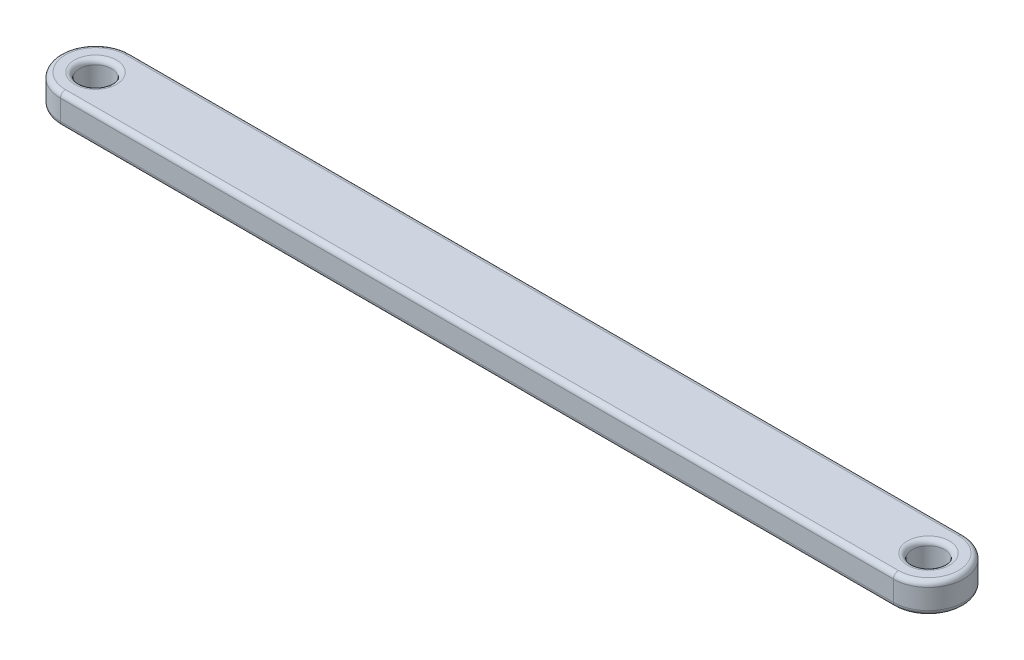
ISO-10303-21;
HEADER;
FILE_DESCRIPTION(('STEP AP214'),'2;1');
FILE_NAME('part.step','',(''),(''),'','','');
FILE_SCHEMA(('AUTOMOTIVE_DESIGN { 1 0 10303 214 1 1 1 1 }'));
ENDSEC;
DATA;
#1=APPLICATION_CONTEXT('core data for automotive mechanical design processes');
#2=APPLICATION_PROTOCOL_DEFINITION('international standard','automotive_design',2000,#1);
#3=PRODUCT_CONTEXT('',#1,'mechanical');
#4=PRODUCT('Part','Part','',(#3));
#5=PRODUCT_RELATED_PRODUCT_CATEGORY('part','',(#4));
#6=PRODUCT_DEFINITION_FORMATION('','',#4);
#7=PRODUCT_DEFINITION_CONTEXT('part definition',#1,'design');
#8=PRODUCT_DEFINITION('design','',#6,#7);
#9=PRODUCT_DEFINITION_SHAPE('','',#8);
#10=(LENGTH_UNIT() NAMED_UNIT(*) SI_UNIT(.MILLI.,.METRE.));
#11=(NAMED_UNIT(*) PLANE_ANGLE_UNIT() SI_UNIT($,.RADIAN.));
#12=(NAMED_UNIT(*) SI_UNIT($,.STERADIAN.) SOLID_ANGLE_UNIT());
#13=UNCERTAINTY_MEASURE_WITH_UNIT(LENGTH_MEASURE(1.E-05),#10,'distance_accuracy_value','');
#14=(GEOMETRIC_REPRESENTATION_CONTEXT(3) GLOBAL_UNCERTAINTY_ASSIGNED_CONTEXT((#13)) GLOBAL_UNIT_ASSIGNED_CONTEXT((#10,
#11,#12)) REPRESENTATION_CONTEXT('',''));
#15=CARTESIAN_POINT('',(0.,0.,0.));
#16=DIRECTION('',(0.,0.,1.));
#17=DIRECTION('',(1.,0.,0.));
#18=AXIS2_PLACEMENT_3D('',#15,#16,#17);
#19=CARTESIAN_POINT('',(-41.55,3.,0.));
#20=DIRECTION('',(0.,1.,0.));
#21=DIRECTION('',(0.,0.,1.));
#22=AXIS2_PLACEMENT_3D('',#19,#20,#21);
#23=PLANE('',#22);
#24=CARTESIAN_POINT('',(-41.55,3.,0.));
#25=DIRECTION('',(0.,1.,0.));
#26=DIRECTION('',(0.,0.,1.));
#27=AXIS2_PLACEMENT_3D('',#24,#25,#26);
#28=CIRCLE('',#27,2.1);
#29=CARTESIAN_POINT('',(-41.55,3.,2.1));
#30=VERTEX_POINT('',#29);
#31=EDGE_CURVE('E11',#30,#30,#28,.F.);
#32=ORIENTED_EDGE('',*,*,#31,.T.);
#33=EDGE_LOOP('',(#32));
#34=FACE_BOUND('',#33,.T.);
#35=CARTESIAN_POINT('',(41.55,3.,0.));
#36=DIRECTION('',(0.,1.,0.));
#37=DIRECTION('',(0.,0.,1.));
#38=AXIS2_PLACEMENT_3D('',#35,#36,#37);
#39=CIRCLE('',#38,3.);
#40=CARTESIAN_POINT('',(41.55,3.,2.99999999999998));
#41=VERTEX_POINT('',#40);
#42=CARTESIAN_POINT('',(41.55,3.,-3.00000000000001));
#43=VERTEX_POINT('',#42);
#44=EDGE_CURVE('E54',#41,#43,#39,.T.);
#45=ORIENTED_EDGE('',*,*,#44,.T.);
#46=DIRECTION('',(-1.,0.,0.));
#47=VECTOR('',#46,1.);
#48=CARTESIAN_POINT('',(-41.55,3.,-3.));
#49=LINE('',#48,#47);
#50=CARTESIAN_POINT('',(-41.55,3.,-3.));
#51=VERTEX_POINT('',#50);
#52=EDGE_CURVE('E46',#43,#51,#49,.T.);
#53=ORIENTED_EDGE('',*,*,#52,.T.);
#54=CARTESIAN_POINT('',(-41.55,3.,0.));
#55=DIRECTION('',(0.,1.,0.));
#56=DIRECTION('',(0.,0.,1.));
#57=AXIS2_PLACEMENT_3D('',#54,#55,#56);
#58=CIRCLE('',#57,3.);
#59=CARTESIAN_POINT('',(-41.55,3.,3.));
#60=VERTEX_POINT('',#59);
#61=EDGE_CURVE('E172',#51,#60,#58,.T.);
#62=ORIENTED_EDGE('',*,*,#61,.T.);
#63=DIRECTION('',(1.,0.,0.));
#64=VECTOR('',#63,1.);
#65=CARTESIAN_POINT('',(41.55,3.,2.99999999999998));
#66=LINE('',#65,#64);
#67=EDGE_CURVE('E59',#60,#41,#66,.T.);
#68=ORIENTED_EDGE('',*,*,#67,.T.);
#69=EDGE_LOOP('',(#45,#53,#62,#68));
#70=FACE_BOUND('',#69,.T.);
#71=CARTESIAN_POINT('',(41.55,3.,0.));
#72=DIRECTION('',(0.,1.,0.));
#73=DIRECTION('',(0.,0.,1.));
#74=AXIS2_PLACEMENT_3D('',#71,#72,#73);
#75=CIRCLE('',#74,2.1);
#76=CARTESIAN_POINT('',(41.55,3.,2.09999999999998));
#77=VERTEX_POINT('',#76);
#78=EDGE_CURVE('E169',#77,#77,#75,.F.);
#79=ORIENTED_EDGE('',*,*,#78,.T.);
#80=EDGE_LOOP('',(#79));
#81=FACE_BOUND('',#80,.T.);
#82=ADVANCED_FACE('F37',(#34,#70,#81),#23,.T.);
#83=CARTESIAN_POINT('',(-41.55,0.,0.));
#84=DIRECTION('',(0.,1.,0.));
#85=DIRECTION('',(0.,0.,1.));
#86=AXIS2_PLACEMENT_3D('',#83,#84,#85);
#87=PLANE('',#86);
#88=CARTESIAN_POINT('',(-41.55,0.,0.));
#89=DIRECTION('',(0.,1.,0.));
#90=DIRECTION('',(0.,0.,1.));
#91=AXIS2_PLACEMENT_3D('',#88,#89,#90);
#92=CIRCLE('',#91,2.1);
#93=CARTESIAN_POINT('',(-41.55,0.,2.1));
#94=VERTEX_POINT('',#93);
#95=EDGE_CURVE('E134',#94,#94,#92,.T.);
#96=ORIENTED_EDGE('',*,*,#95,.T.);
#97=EDGE_LOOP('',(#96));
#98=FACE_BOUND('',#97,.T.);
#99=CARTESIAN_POINT('',(41.55,0.,0.));
#100=DIRECTION('',(0.,1.,0.));
#101=DIRECTION('',(0.,0.,1.));
#102=AXIS2_PLACEMENT_3D('',#99,#100,#101);
#103=CIRCLE('',#102,2.1);
#104=CARTESIAN_POINT('',(41.55,0.,2.09999999999998));
#105=VERTEX_POINT('',#104);
#106=EDGE_CURVE('E131',#105,#105,#103,.T.);
#107=ORIENTED_EDGE('',*,*,#106,.T.);
#108=EDGE_LOOP('',(#107));
#109=FACE_BOUND('',#108,.T.);
#110=CARTESIAN_POINT('',(41.55,0.,0.));
#111=DIRECTION('',(0.,1.,0.));
#112=DIRECTION('',(0.,0.,1.));
#113=AXIS2_PLACEMENT_3D('',#110,#111,#112);
#114=CIRCLE('',#113,3.);
#115=CARTESIAN_POINT('',(41.55,0.,-3.00000000000001));
#116=VERTEX_POINT('',#115);
#117=CARTESIAN_POINT('',(41.55,0.,2.99999999999998));
#118=VERTEX_POINT('',#117);
#119=EDGE_CURVE('E130',#116,#118,#114,.F.);
#120=ORIENTED_EDGE('',*,*,#119,.T.);
#121=DIRECTION('',(1.,0.,0.));
#122=VECTOR('',#121,1.);
#123=CARTESIAN_POINT('',(-41.55,0.,3.));
#124=LINE('',#123,#122);
#125=CARTESIAN_POINT('',(-41.55,0.,3.));
#126=VERTEX_POINT('',#125);
#127=EDGE_CURVE('E109',#118,#126,#124,.F.);
#128=ORIENTED_EDGE('',*,*,#127,.T.);
#129=CARTESIAN_POINT('',(-41.55,0.,0.));
#130=DIRECTION('',(0.,1.,0.));
#131=DIRECTION('',(0.,0.,1.));
#132=AXIS2_PLACEMENT_3D('',#129,#130,#131);
#133=CIRCLE('',#132,3.);
#134=CARTESIAN_POINT('',(-41.55,0.,-3.));
#135=VERTEX_POINT('',#134);
#136=EDGE_CURVE('E119',#126,#135,#133,.F.);
#137=ORIENTED_EDGE('',*,*,#136,.T.);
#138=DIRECTION('',(-1.,0.,0.));
#139=VECTOR('',#138,1.);
#140=CARTESIAN_POINT('',(-41.55,0.,-3.));
#141=LINE('',#140,#139);
#142=EDGE_CURVE('E125',#135,#116,#141,.F.);
#143=ORIENTED_EDGE('',*,*,#142,.T.);
#144=EDGE_LOOP('',(#120,#128,#137,#143));
#145=FACE_BOUND('',#144,.T.);
#146=ADVANCED_FACE('F128',(#98,#109,#145),#87,.F.);
#147=CARTESIAN_POINT('',(-41.55,3.,0.));
#148=DIRECTION('',(0.,-1.,0.));
#149=DIRECTION('',(0.,0.,-1.));
#150=AXIS2_PLACEMENT_3D('',#147,#148,#149);
#151=CYLINDRICAL_SURFACE('',#150,3.5);
#152=DIRECTION('',(0.,-1.,0.));
#153=VECTOR('',#152,1.);
#154=CARTESIAN_POINT('',(-41.55,3.,-3.5));
#155=LINE('',#154,#153);
#156=CARTESIAN_POINT('',(-41.55,2.5,-3.5));
#157=VERTEX_POINT('',#156);
#158=CARTESIAN_POINT('',(-41.55,0.5,-3.5));
#159=VERTEX_POINT('',#158);
#160=EDGE_CURVE('E181',#157,#159,#155,.T.);
#161=ORIENTED_EDGE('',*,*,#160,.T.);
#162=CARTESIAN_POINT('',(-41.55,0.5,0.));
#163=DIRECTION('',(0.,1.,0.));
#164=DIRECTION('',(0.,0.,1.));
#165=AXIS2_PLACEMENT_3D('',#162,#163,#164);
#166=CIRCLE('',#165,3.5);
#167=CARTESIAN_POINT('',(-41.55,0.5,3.5));
#168=VERTEX_POINT('',#167);
#169=EDGE_CURVE('E167',#159,#168,#166,.T.);
#170=ORIENTED_EDGE('',*,*,#169,.T.);
#171=DIRECTION('',(0.,-1.,0.));
#172=VECTOR('',#171,1.);
#173=CARTESIAN_POINT('',(-41.55,3.,3.5));
#174=LINE('',#173,#172);
#175=CARTESIAN_POINT('',(-41.55,2.5,3.5));
#176=VERTEX_POINT('',#175);
#177=EDGE_CURVE('E126',#176,#168,#174,.T.);
#178=ORIENTED_EDGE('',*,*,#177,.F.);
#179=CARTESIAN_POINT('',(-41.55,2.5,0.));
#180=DIRECTION('',(0.,1.,0.));
#181=DIRECTION('',(0.,0.,1.));
#182=AXIS2_PLACEMENT_3D('',#179,#180,#181);
#183=CIRCLE('',#182,3.5);
#184=EDGE_CURVE('E165',#176,#157,#183,.F.);
#185=ORIENTED_EDGE('',*,*,#184,.T.);
#186=EDGE_LOOP('',(#161,#170,#178,#185));
#187=FACE_BOUND('',#186,.T.);
#188=ADVANCED_FACE('F207',(#187),#151,.T.);
#189=CARTESIAN_POINT('',(-41.55,3.,3.5));
#190=DIRECTION('',(0.,0.,-1.));
#191=DIRECTION('',(-1.,0.,0.));
#192=AXIS2_PLACEMENT_3D('',#189,#190,#191);
#193=PLANE('',#192);
#194=ORIENTED_EDGE('',*,*,#177,.T.);
#195=DIRECTION('',(1.,0.,0.));
#196=VECTOR('',#195,1.);
#197=CARTESIAN_POINT('',(-41.55,0.5,3.5));
#198=LINE('',#197,#196);
#199=CARTESIAN_POINT('',(41.55,0.5,3.49999999999998));
#200=VERTEX_POINT('',#199);
#201=EDGE_CURVE('E112',#168,#200,#198,.T.);
#202=ORIENTED_EDGE('',*,*,#201,.T.);
#203=DIRECTION('',(0.,-1.,0.));
#204=VECTOR('',#203,1.);
#205=CARTESIAN_POINT('',(41.55,3.,3.49999999999998));
#206=LINE('',#205,#204);
#207=CARTESIAN_POINT('',(41.55,2.5,3.49999999999998));
#208=VERTEX_POINT('',#207);
#209=EDGE_CURVE('E204',#208,#200,#206,.T.);
#210=ORIENTED_EDGE('',*,*,#209,.F.);
#211=DIRECTION('',(1.,0.,0.));
#212=VECTOR('',#211,1.);
#213=CARTESIAN_POINT('',(-41.55,2.5,3.5));
#214=LINE('',#213,#212);
#215=EDGE_CURVE('E153',#208,#176,#214,.F.);
#216=ORIENTED_EDGE('',*,*,#215,.T.);
#217=EDGE_LOOP('',(#194,#202,#210,#216));
#218=FACE_BOUND('',#217,.T.);
#219=ADVANCED_FACE('F202',(#218),#193,.F.);
#220=CARTESIAN_POINT('',(41.55,3.,0.));
#221=DIRECTION('',(0.,-1.,0.));
#222=DIRECTION('',(0.,0.,-1.));
#223=AXIS2_PLACEMENT_3D('',#220,#221,#222);
#224=CYLINDRICAL_SURFACE('',#223,3.5);
#225=ORIENTED_EDGE('',*,*,#209,.T.);
#226=CARTESIAN_POINT('',(41.55,0.5,0.));
#227=DIRECTION('',(0.,1.,0.));
#228=DIRECTION('',(0.,0.,1.));
#229=AXIS2_PLACEMENT_3D('',#226,#227,#228);
#230=CIRCLE('',#229,3.5);
#231=CARTESIAN_POINT('',(41.55,0.5,-3.50000000000001));
#232=VERTEX_POINT('',#231);
#233=EDGE_CURVE('E158',#200,#232,#230,.T.);
#234=ORIENTED_EDGE('',*,*,#233,.T.);
#235=DIRECTION('',(0.,-1.,0.));
#236=VECTOR('',#235,1.);
#237=CARTESIAN_POINT('',(41.55,3.,-3.50000000000001));
#238=LINE('',#237,#236);
#239=CARTESIAN_POINT('',(41.55,2.5,-3.50000000000001));
#240=VERTEX_POINT('',#239);
#241=EDGE_CURVE('E210',#240,#232,#238,.T.);
#242=ORIENTED_EDGE('',*,*,#241,.F.);
#243=CARTESIAN_POINT('',(41.55,2.5,0.));
#244=DIRECTION('',(0.,1.,0.));
#245=DIRECTION('',(0.,0.,1.));
#246=AXIS2_PLACEMENT_3D('',#243,#244,#245);
#247=CIRCLE('',#246,3.5);
#248=EDGE_CURVE('E156',#240,#208,#247,.F.);
#249=ORIENTED_EDGE('',*,*,#248,.T.);
#250=EDGE_LOOP('',(#225,#234,#242,#249));
#251=FACE_BOUND('',#250,.T.);
#252=ADVANCED_FACE('F223',(#251),#224,.T.);
#253=CARTESIAN_POINT('',(-41.55,3.,-3.5));
#254=DIRECTION('',(0.,0.,1.));
#255=DIRECTION('',(1.,0.,0.));
#256=AXIS2_PLACEMENT_3D('',#253,#254,#255);
#257=PLANE('',#256);
#258=ORIENTED_EDGE('',*,*,#241,.T.);
#259=DIRECTION('',(-1.,0.,0.));
#260=VECTOR('',#259,1.);
#261=CARTESIAN_POINT('',(-41.55,0.5,-3.5));
#262=LINE('',#261,#260);
#263=EDGE_CURVE('E163',#232,#159,#262,.T.);
#264=ORIENTED_EDGE('',*,*,#263,.T.);
#265=ORIENTED_EDGE('',*,*,#160,.F.);
#266=DIRECTION('',(-1.,0.,0.));
#267=VECTOR('',#266,1.);
#268=CARTESIAN_POINT('',(41.55,2.5,-3.50000000000001));
#269=LINE('',#268,#267);
#270=EDGE_CURVE('E160',#157,#240,#269,.F.);
#271=ORIENTED_EDGE('',*,*,#270,.T.);
#272=EDGE_LOOP('',(#258,#264,#265,#271));
#273=FACE_BOUND('',#272,.T.);
#274=ADVANCED_FACE('F227',(#273),#257,.F.);
#275=CARTESIAN_POINT('',(41.55,3.,0.));
#276=DIRECTION('',(0.,-1.,0.));
#277=DIRECTION('',(0.,0.,-1.));
#278=AXIS2_PLACEMENT_3D('',#275,#276,#277);
#279=CYLINDRICAL_SURFACE('',#278,1.6);
#280=CARTESIAN_POINT('',(41.55,0.5,0.));
#281=DIRECTION('',(0.,1.,0.));
#282=DIRECTION('',(0.,0.,1.));
#283=AXIS2_PLACEMENT_3D('',#280,#281,#282);
#284=CIRCLE('',#283,1.6);
#285=CARTESIAN_POINT('',(41.55,0.5,1.59999999999998));
#286=VERTEX_POINT('',#285);
#287=EDGE_CURVE('E150',#286,#286,#284,.F.);
#288=ORIENTED_EDGE('',*,*,#287,.T.);
#289=EDGE_LOOP('',(#288));
#290=FACE_BOUND('',#289,.T.);
#291=CARTESIAN_POINT('',(41.55,2.5,0.));
#292=DIRECTION('',(0.,1.,0.));
#293=DIRECTION('',(0.,0.,1.));
#294=AXIS2_PLACEMENT_3D('',#291,#292,#293);
#295=CIRCLE('',#294,1.6);
#296=CARTESIAN_POINT('',(41.55,2.5,1.59999999999998));
#297=VERTEX_POINT('',#296);
#298=EDGE_CURVE('E147',#297,#297,#295,.T.);
#299=ORIENTED_EDGE('',*,*,#298,.T.);
#300=EDGE_LOOP('',(#299));
#301=FACE_BOUND('',#300,.T.);
#302=ADVANCED_FACE('F243',(#290,#301),#279,.F.);
#303=CARTESIAN_POINT('',(-41.55,3.,0.));
#304=DIRECTION('',(0.,-1.,0.));
#305=DIRECTION('',(0.,0.,-1.));
#306=AXIS2_PLACEMENT_3D('',#303,#304,#305);
#307=CYLINDRICAL_SURFACE('',#306,1.6);
#308=CARTESIAN_POINT('',(-41.55,0.5,0.));
#309=DIRECTION('',(0.,1.,0.));
#310=DIRECTION('',(0.,0.,1.));
#311=AXIS2_PLACEMENT_3D('',#308,#309,#310);
#312=CIRCLE('',#311,1.6);
#313=CARTESIAN_POINT('',(-41.55,0.5,1.6));
#314=VERTEX_POINT('',#313);
#315=EDGE_CURVE('E144',#314,#314,#312,.F.);
#316=ORIENTED_EDGE('',*,*,#315,.T.);
#317=EDGE_LOOP('',(#316));
#318=FACE_BOUND('',#317,.T.);
#319=CARTESIAN_POINT('',(-41.55,2.5,0.));
#320=DIRECTION('',(0.,1.,0.));
#321=DIRECTION('',(0.,0.,1.));
#322=AXIS2_PLACEMENT_3D('',#319,#320,#321);
#323=CIRCLE('',#322,1.6);
#324=CARTESIAN_POINT('',(-41.55,2.5,1.6));
#325=VERTEX_POINT('',#324);
#326=EDGE_CURVE('E141',#325,#325,#323,.T.);
#327=ORIENTED_EDGE('',*,*,#326,.T.);
#328=EDGE_LOOP('',(#327));
#329=FACE_BOUND('',#328,.T.);
#330=ADVANCED_FACE('F245',(#318,#329),#307,.F.);
#331=CARTESIAN_POINT('',(-41.55,0.5,0.));
#332=DIRECTION('',(0.,1.,0.));
#333=DIRECTION('',(0.,0.,1.));
#334=AXIS2_PLACEMENT_3D('',#331,#332,#333);
#335=TOROIDAL_SURFACE('',#334,2.1,0.5);
#336=ORIENTED_EDGE('',*,*,#315,.F.);
#337=EDGE_LOOP('',(#336));
#338=FACE_BOUND('',#337,.T.);
#339=ORIENTED_EDGE('',*,*,#95,.F.);
#340=EDGE_LOOP('',(#339));
#341=FACE_BOUND('',#340,.T.);
#342=ADVANCED_FACE('F252',(#338,#341),#335,.T.);
#343=CARTESIAN_POINT('',(41.55,0.5,0.));
#344=DIRECTION('',(0.,1.,0.));
#345=DIRECTION('',(0.,0.,1.));
#346=AXIS2_PLACEMENT_3D('',#343,#344,#345);
#347=TOROIDAL_SURFACE('',#346,2.1,0.5);
#348=ORIENTED_EDGE('',*,*,#287,.F.);
#349=EDGE_LOOP('',(#348));
#350=FACE_BOUND('',#349,.T.);
#351=ORIENTED_EDGE('',*,*,#106,.F.);
#352=EDGE_LOOP('',(#351));
#353=FACE_BOUND('',#352,.T.);
#354=ADVANCED_FACE('F268',(#350,#353),#347,.T.);
#355=CARTESIAN_POINT('',(-41.55,0.5,-3.));
#356=DIRECTION('',(-1.,0.,0.));
#357=DIRECTION('',(0.,0.,1.));
#358=AXIS2_PLACEMENT_3D('',#355,#356,#357);
#359=CYLINDRICAL_SURFACE('',#358,0.5);
#360=CARTESIAN_POINT('',(41.55,0.5,-3.00000000000001));
#361=DIRECTION('',(1.,0.,0.));
#362=DIRECTION('',(0.,0.,-1.));
#363=AXIS2_PLACEMENT_3D('',#360,#361,#362);
#364=CIRCLE('',#363,0.5);
#365=EDGE_CURVE('E115',#116,#232,#364,.T.);
#366=ORIENTED_EDGE('',*,*,#365,.F.);
#367=ORIENTED_EDGE('',*,*,#142,.F.);
#368=CARTESIAN_POINT('',(-41.55,0.5,-3.));
#369=DIRECTION('',(-1.,0.,0.));
#370=DIRECTION('',(0.,0.,1.));
#371=AXIS2_PLACEMENT_3D('',#368,#369,#370);
#372=CIRCLE('',#371,0.5);
#373=EDGE_CURVE('E122',#159,#135,#372,.T.);
#374=ORIENTED_EDGE('',*,*,#373,.F.);
#375=ORIENTED_EDGE('',*,*,#263,.F.);
#376=EDGE_LOOP('',(#366,#367,#374,#375));
#377=FACE_BOUND('',#376,.T.);
#378=ADVANCED_FACE('F216',(#377),#359,.T.);
#379=CARTESIAN_POINT('',(-41.55,0.5,0.));
#380=DIRECTION('',(0.,1.,0.));
#381=DIRECTION('',(0.,0.,1.));
#382=AXIS2_PLACEMENT_3D('',#379,#380,#381);
#383=TOROIDAL_SURFACE('',#382,3.,0.5);
#384=ORIENTED_EDGE('',*,*,#373,.T.);
#385=ORIENTED_EDGE('',*,*,#136,.F.);
#386=CARTESIAN_POINT('',(-41.55,0.5,3.));
#387=DIRECTION('',(1.,0.,0.));
#388=DIRECTION('',(0.,0.,-1.));
#389=AXIS2_PLACEMENT_3D('',#386,#387,#388);
#390=CIRCLE('',#389,0.5);
#391=EDGE_CURVE('E105',#168,#126,#390,.T.);
#392=ORIENTED_EDGE('',*,*,#391,.F.);
#393=ORIENTED_EDGE('',*,*,#169,.F.);
#394=EDGE_LOOP('',(#384,#385,#392,#393));
#395=FACE_BOUND('',#394,.T.);
#396=ADVANCED_FACE('F120',(#395),#383,.T.);
#397=CARTESIAN_POINT('',(41.55,0.5,0.));
#398=DIRECTION('',(0.,1.,0.));
#399=DIRECTION('',(0.,0.,1.));
#400=AXIS2_PLACEMENT_3D('',#397,#398,#399);
#401=TOROIDAL_SURFACE('',#400,3.,0.5);
#402=ORIENTED_EDGE('',*,*,#365,.T.);
#403=ORIENTED_EDGE('',*,*,#233,.F.);
#404=CARTESIAN_POINT('',(41.55,0.5,2.99999999999998));
#405=DIRECTION('',(-1.,0.,0.));
#406=DIRECTION('',(0.,0.,1.));
#407=AXIS2_PLACEMENT_3D('',#404,#405,#406);
#408=CIRCLE('',#407,0.5);
#409=EDGE_CURVE('E116',#118,#200,#408,.T.);
#410=ORIENTED_EDGE('',*,*,#409,.F.);
#411=ORIENTED_EDGE('',*,*,#119,.F.);
#412=EDGE_LOOP('',(#402,#403,#410,#411));
#413=FACE_BOUND('',#412,.T.);
#414=ADVANCED_FACE('F219',(#413),#401,.T.);
#415=CARTESIAN_POINT('',(-41.55,0.5,3.));
#416=DIRECTION('',(1.,0.,0.));
#417=DIRECTION('',(0.,0.,-1.));
#418=AXIS2_PLACEMENT_3D('',#415,#416,#417);
#419=CYLINDRICAL_SURFACE('',#418,0.5);
#420=ORIENTED_EDGE('',*,*,#391,.T.);
#421=ORIENTED_EDGE('',*,*,#127,.F.);
#422=ORIENTED_EDGE('',*,*,#409,.T.);
#423=ORIENTED_EDGE('',*,*,#201,.F.);
#424=EDGE_LOOP('',(#420,#421,#422,#423));
#425=FACE_BOUND('',#424,.T.);
#426=ADVANCED_FACE('F107',(#425),#419,.T.);
#427=CARTESIAN_POINT('',(-41.55,2.5,0.));
#428=DIRECTION('',(0.,1.,0.));
#429=DIRECTION('',(0.,0.,1.));
#430=AXIS2_PLACEMENT_3D('',#427,#428,#429);
#431=TOROIDAL_SURFACE('',#430,2.1,0.5);
#432=ORIENTED_EDGE('',*,*,#31,.F.);
#433=EDGE_LOOP('',(#432));
#434=FACE_BOUND('',#433,.T.);
#435=ORIENTED_EDGE('',*,*,#326,.F.);
#436=EDGE_LOOP('',(#435));
#437=FACE_BOUND('',#436,.T.);
#438=ADVANCED_FACE('F275',(#434,#437),#431,.T.);
#439=CARTESIAN_POINT('',(-41.55,2.5,3.));
#440=DIRECTION('',(-1.,0.,0.));
#441=DIRECTION('',(0.,0.,1.));
#442=AXIS2_PLACEMENT_3D('',#439,#440,#441);
#443=CYLINDRICAL_SURFACE('',#442,0.5);
#444=CARTESIAN_POINT('',(-41.55,2.5,3.));
#445=DIRECTION('',(-1.,0.,0.));
#446=DIRECTION('',(0.,0.,1.));
#447=AXIS2_PLACEMENT_3D('',#444,#445,#446);
#448=CIRCLE('',#447,0.5);
#449=EDGE_CURVE('E185',#176,#60,#448,.T.);
#450=ORIENTED_EDGE('',*,*,#449,.F.);
#451=ORIENTED_EDGE('',*,*,#215,.F.);
#452=CARTESIAN_POINT('',(41.55,2.5,2.99999999999998));
#453=DIRECTION('',(1.,0.,0.));
#454=DIRECTION('',(0.,0.,-1.));
#455=AXIS2_PLACEMENT_3D('',#452,#453,#454);
#456=CIRCLE('',#455,0.5);
#457=EDGE_CURVE('E41',#41,#208,#456,.T.);
#458=ORIENTED_EDGE('',*,*,#457,.F.);
#459=ORIENTED_EDGE('',*,*,#67,.F.);
#460=EDGE_LOOP('',(#450,#451,#458,#459));
#461=FACE_BOUND('',#460,.T.);
#462=ADVANCED_FACE('F197',(#461),#443,.T.);
#463=CARTESIAN_POINT('',(41.55,2.5,0.));
#464=DIRECTION('',(0.,1.,0.));
#465=DIRECTION('',(0.,0.,1.));
#466=AXIS2_PLACEMENT_3D('',#463,#464,#465);
#467=TOROIDAL_SURFACE('',#466,3.,0.5);
#468=ORIENTED_EDGE('',*,*,#457,.T.);
#469=ORIENTED_EDGE('',*,*,#248,.F.);
#470=CARTESIAN_POINT('',(41.55,2.5,-3.00000000000001));
#471=DIRECTION('',(-1.,0.,0.));
#472=DIRECTION('',(0.,0.,1.));
#473=AXIS2_PLACEMENT_3D('',#470,#471,#472);
#474=CIRCLE('',#473,0.5);
#475=EDGE_CURVE('E184',#43,#240,#474,.T.);
#476=ORIENTED_EDGE('',*,*,#475,.F.);
#477=ORIENTED_EDGE('',*,*,#44,.F.);
#478=EDGE_LOOP('',(#468,#469,#476,#477));
#479=FACE_BOUND('',#478,.T.);
#480=ADVANCED_FACE('F194',(#479),#467,.T.);
#481=CARTESIAN_POINT('',(-41.55,2.5,0.));
#482=DIRECTION('',(0.,1.,0.));
#483=DIRECTION('',(0.,0.,1.));
#484=AXIS2_PLACEMENT_3D('',#481,#482,#483);
#485=TOROIDAL_SURFACE('',#484,3.,0.5);
#486=ORIENTED_EDGE('',*,*,#449,.T.);
#487=ORIENTED_EDGE('',*,*,#61,.F.);
#488=CARTESIAN_POINT('',(-41.55,2.5,-3.));
#489=DIRECTION('',(1.,0.,0.));
#490=DIRECTION('',(0.,0.,-1.));
#491=AXIS2_PLACEMENT_3D('',#488,#489,#490);
#492=CIRCLE('',#491,0.5);
#493=EDGE_CURVE('E182',#157,#51,#492,.T.);
#494=ORIENTED_EDGE('',*,*,#493,.F.);
#495=ORIENTED_EDGE('',*,*,#184,.F.);
#496=EDGE_LOOP('',(#486,#487,#494,#495));
#497=FACE_BOUND('',#496,.T.);
#498=ADVANCED_FACE('F232',(#497),#485,.T.);
#499=CARTESIAN_POINT('',(-41.55,2.5,-3.));
#500=DIRECTION('',(1.,0.,0.));
#501=DIRECTION('',(0.,0.,-1.));
#502=AXIS2_PLACEMENT_3D('',#499,#500,#501);
#503=CYLINDRICAL_SURFACE('',#502,0.5);
#504=ORIENTED_EDGE('',*,*,#475,.T.);
#505=ORIENTED_EDGE('',*,*,#270,.F.);
#506=ORIENTED_EDGE('',*,*,#493,.T.);
#507=ORIENTED_EDGE('',*,*,#52,.F.);
#508=EDGE_LOOP('',(#504,#505,#506,#507));
#509=FACE_BOUND('',#508,.T.);
#510=ADVANCED_FACE('F230',(#509),#503,.T.);
#511=CARTESIAN_POINT('',(41.55,2.5,0.));
#512=DIRECTION('',(0.,1.,0.));
#513=DIRECTION('',(0.,0.,1.));
#514=AXIS2_PLACEMENT_3D('',#511,#512,#513);
#515=TOROIDAL_SURFACE('',#514,2.1,0.5);
#516=ORIENTED_EDGE('',*,*,#78,.F.);
#517=EDGE_LOOP('',(#516));
#518=FACE_BOUND('',#517,.T.);
#519=ORIENTED_EDGE('',*,*,#298,.F.);
#520=EDGE_LOOP('',(#519));
#521=FACE_BOUND('',#520,.T.);
#522=ADVANCED_FACE('F39',(#518,#521),#515,.T.);
#523=CLOSED_SHELL('',(#82,#146,#188,#219,#252,#274,#302,#330,#342,#354,#378,#396,#414,#426,#438,
#462,#480,#498,#510,#522));
#524=MANIFOLD_SOLID_BREP('B2',#523);
#525=ADVANCED_BREP_SHAPE_REPRESENTATION('',(#18,#524),#14);
#526=SHAPE_DEFINITION_REPRESENTATION(#9,#525);
ENDSEC;
END-ISO-10303-21;
